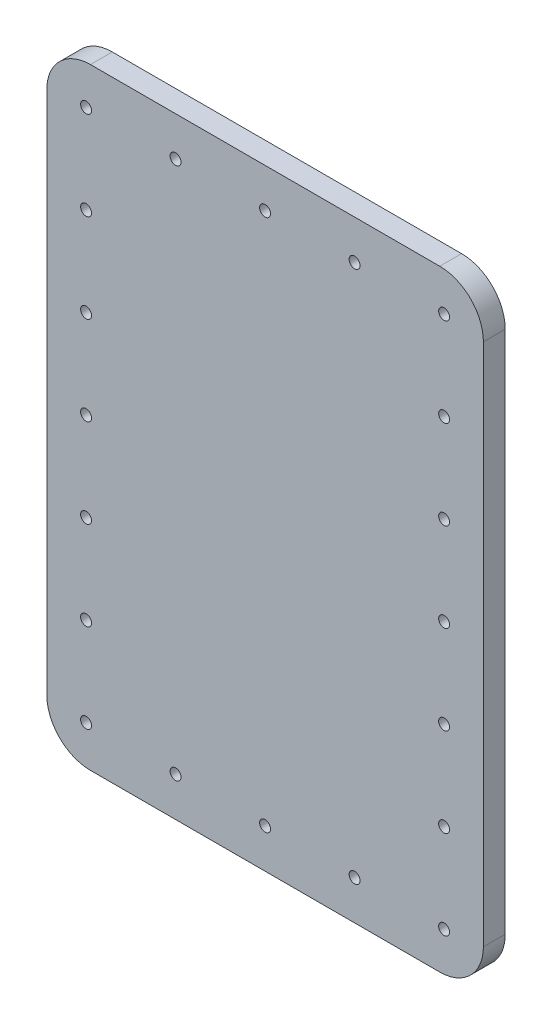
ISO-10303-21;
HEADER;
FILE_DESCRIPTION(('STEP AP214'),'2;1');
FILE_NAME('part.step','',(''),(''),'','','');
FILE_SCHEMA(('AUTOMOTIVE_DESIGN { 1 0 10303 214 1 1 1 1 }'));
ENDSEC;
DATA;
#1=APPLICATION_CONTEXT('core data for automotive mechanical design processes');
#2=APPLICATION_PROTOCOL_DEFINITION('international standard','automotive_design',2000,#1);
#3=PRODUCT_CONTEXT('',#1,'mechanical');
#4=PRODUCT('Part','Part','',(#3));
#5=PRODUCT_RELATED_PRODUCT_CATEGORY('part','',(#4));
#6=PRODUCT_DEFINITION_FORMATION('','',#4);
#7=PRODUCT_DEFINITION_CONTEXT('part definition',#1,'design');
#8=PRODUCT_DEFINITION('design','',#6,#7);
#9=PRODUCT_DEFINITION_SHAPE('','',#8);
#10=(LENGTH_UNIT() NAMED_UNIT(*) SI_UNIT(.MILLI.,.METRE.));
#11=(NAMED_UNIT(*) PLANE_ANGLE_UNIT() SI_UNIT($,.RADIAN.));
#12=(NAMED_UNIT(*) SI_UNIT($,.STERADIAN.) SOLID_ANGLE_UNIT());
#13=UNCERTAINTY_MEASURE_WITH_UNIT(LENGTH_MEASURE(1.E-05),#10,'distance_accuracy_value','');
#14=(GEOMETRIC_REPRESENTATION_CONTEXT(3) GLOBAL_UNCERTAINTY_ASSIGNED_CONTEXT((#13)) GLOBAL_UNIT_ASSIGNED_CONTEXT((#10,
#11,#12)) REPRESENTATION_CONTEXT('',''));
#15=CARTESIAN_POINT('',(0.,0.,0.));
#16=DIRECTION('',(0.,0.,1.));
#17=DIRECTION('',(1.,0.,0.));
#18=AXIS2_PLACEMENT_3D('',#15,#16,#17);
#19=CARTESIAN_POINT('',(0.,0.,5.));
#20=DIRECTION('',(0.,0.,-1.));
#21=DIRECTION('',(-1.,0.,0.));
#22=AXIS2_PLACEMENT_3D('',#19,#20,#21);
#23=PLANE('',#22);
#24=DIRECTION('',(0.,-1.,0.));
#25=VECTOR('',#24,1.);
#26=CARTESIAN_POINT('',(-50.,-70.,5.));
#27=LINE('',#26,#25);
#28=CARTESIAN_POINT('',(-50.,60.,5.));
#29=VERTEX_POINT('',#28);
#30=CARTESIAN_POINT('',(-50.,-60.,5.));
#31=VERTEX_POINT('',#30);
#32=EDGE_CURVE('E164',#29,#31,#27,.T.);
#33=ORIENTED_EDGE('',*,*,#32,.T.);
#34=CARTESIAN_POINT('',(-40.,-60.,5.));
#35=DIRECTION('',(0.,0.,-1.));
#36=DIRECTION('',(-1.,0.,0.));
#37=AXIS2_PLACEMENT_3D('',#34,#35,#36);
#38=CIRCLE('',#37,10.);
#39=CARTESIAN_POINT('',(-40.,-70.,5.));
#40=VERTEX_POINT('',#39);
#41=EDGE_CURVE('E147',#31,#40,#38,.F.);
#42=ORIENTED_EDGE('',*,*,#41,.T.);
#43=DIRECTION('',(1.,0.,0.));
#44=VECTOR('',#43,1.);
#45=CARTESIAN_POINT('',(-50.,-70.,5.));
#46=LINE('',#45,#44);
#47=CARTESIAN_POINT('',(40.,-70.,5.));
#48=VERTEX_POINT('',#47);
#49=EDGE_CURVE('E118',#40,#48,#46,.T.);
#50=ORIENTED_EDGE('',*,*,#49,.T.);
#51=CARTESIAN_POINT('',(40.,-60.,5.));
#52=DIRECTION('',(0.,0.,-1.));
#53=DIRECTION('',(-1.,0.,0.));
#54=AXIS2_PLACEMENT_3D('',#51,#52,#53);
#55=CIRCLE('',#54,10.);
#56=CARTESIAN_POINT('',(50.,-60.,5.));
#57=VERTEX_POINT('',#56);
#58=EDGE_CURVE('E145',#48,#57,#55,.F.);
#59=ORIENTED_EDGE('',*,*,#58,.T.);
#60=DIRECTION('',(0.,1.,0.));
#61=VECTOR('',#60,1.);
#62=CARTESIAN_POINT('',(50.,-70.,5.));
#63=LINE('',#62,#61);
#64=CARTESIAN_POINT('',(50.,60.,5.));
#65=VERTEX_POINT('',#64);
#66=EDGE_CURVE('E125',#57,#65,#63,.T.);
#67=ORIENTED_EDGE('',*,*,#66,.T.);
#68=CARTESIAN_POINT('',(40.,60.,5.));
#69=DIRECTION('',(0.,0.,-1.));
#70=DIRECTION('',(-1.,0.,0.));
#71=AXIS2_PLACEMENT_3D('',#68,#69,#70);
#72=CIRCLE('',#71,10.);
#73=CARTESIAN_POINT('',(40.,70.,5.));
#74=VERTEX_POINT('',#73);
#75=EDGE_CURVE('E53',#65,#74,#72,.F.);
#76=ORIENTED_EDGE('',*,*,#75,.T.);
#77=DIRECTION('',(-1.,0.,0.));
#78=VECTOR('',#77,1.);
#79=CARTESIAN_POINT('',(-50.,70.,5.));
#80=LINE('',#79,#78);
#81=CARTESIAN_POINT('',(-40.,70.,5.));
#82=VERTEX_POINT('',#81);
#83=EDGE_CURVE('E128',#74,#82,#80,.T.);
#84=ORIENTED_EDGE('',*,*,#83,.T.);
#85=CARTESIAN_POINT('',(-40.,60.,5.));
#86=DIRECTION('',(0.,0.,-1.));
#87=DIRECTION('',(-1.,0.,0.));
#88=AXIS2_PLACEMENT_3D('',#85,#86,#87);
#89=CIRCLE('',#88,10.);
#90=EDGE_CURVE('E143',#82,#29,#89,.F.);
#91=ORIENTED_EDGE('',*,*,#90,.T.);
#92=EDGE_LOOP('',(#33,#42,#50,#59,#67,#76,#84,#91));
#93=FACE_BOUND('',#92,.T.);
#94=CARTESIAN_POINT('',(0.,61.,5.));
#95=DIRECTION('',(0.,0.,1.));
#96=DIRECTION('',(1.,0.,0.));
#97=AXIS2_PLACEMENT_3D('',#94,#95,#96);
#98=CIRCLE('',#97,1.25);
#99=CARTESIAN_POINT('',(1.24999999999999,61.,5.));
#100=VERTEX_POINT('',#99);
#101=EDGE_CURVE('E160',#100,#100,#98,.T.);
#102=ORIENTED_EDGE('',*,*,#101,.F.);
#103=EDGE_LOOP('',(#102));
#104=FACE_BOUND('',#103,.T.);
#105=CARTESIAN_POINT('',(-41.,61.,5.));
#106=DIRECTION('',(0.,0.,1.));
#107=DIRECTION('',(1.,0.,0.));
#108=AXIS2_PLACEMENT_3D('',#105,#106,#107);
#109=CIRCLE('',#108,1.25);
#110=CARTESIAN_POINT('',(-39.75,61.,5.));
#111=VERTEX_POINT('',#110);
#112=EDGE_CURVE('E171',#111,#111,#109,.T.);
#113=ORIENTED_EDGE('',*,*,#112,.F.);
#114=EDGE_LOOP('',(#113));
#115=FACE_BOUND('',#114,.T.);
#116=CARTESIAN_POINT('',(-20.5,61.,5.));
#117=DIRECTION('',(0.,0.,1.));
#118=DIRECTION('',(1.,0.,0.));
#119=AXIS2_PLACEMENT_3D('',#116,#117,#118);
#120=CIRCLE('',#119,1.25);
#121=CARTESIAN_POINT('',(-19.25,61.,5.));
#122=VERTEX_POINT('',#121);
#123=EDGE_CURVE('E177',#122,#122,#120,.T.);
#124=ORIENTED_EDGE('',*,*,#123,.F.);
#125=EDGE_LOOP('',(#124));
#126=FACE_BOUND('',#125,.T.);
#127=CARTESIAN_POINT('',(20.5,61.,5.));
#128=DIRECTION('',(0.,0.,1.));
#129=DIRECTION('',(1.,0.,0.));
#130=AXIS2_PLACEMENT_3D('',#127,#128,#129);
#131=CIRCLE('',#130,1.25);
#132=CARTESIAN_POINT('',(21.75,61.,5.));
#133=VERTEX_POINT('',#132);
#134=EDGE_CURVE('E183',#133,#133,#131,.T.);
#135=ORIENTED_EDGE('',*,*,#134,.F.);
#136=EDGE_LOOP('',(#135));
#137=FACE_BOUND('',#136,.T.);
#138=CARTESIAN_POINT('',(41.,61.,5.));
#139=DIRECTION('',(0.,0.,1.));
#140=DIRECTION('',(1.,0.,0.));
#141=AXIS2_PLACEMENT_3D('',#138,#139,#140);
#142=CIRCLE('',#141,1.25);
#143=CARTESIAN_POINT('',(42.25,61.,5.));
#144=VERTEX_POINT('',#143);
#145=EDGE_CURVE('E189',#144,#144,#142,.T.);
#146=ORIENTED_EDGE('',*,*,#145,.F.);
#147=EDGE_LOOP('',(#146));
#148=FACE_BOUND('',#147,.T.);
#149=CARTESIAN_POINT('',(-41.,0.,5.));
#150=DIRECTION('',(0.,0.,1.));
#151=DIRECTION('',(1.,0.,0.));
#152=AXIS2_PLACEMENT_3D('',#149,#150,#151);
#153=CIRCLE('',#152,1.25);
#154=CARTESIAN_POINT('',(-39.75,0.,5.));
#155=VERTEX_POINT('',#154);
#156=EDGE_CURVE('E195',#155,#155,#153,.T.);
#157=ORIENTED_EDGE('',*,*,#156,.F.);
#158=EDGE_LOOP('',(#157));
#159=FACE_BOUND('',#158,.T.);
#160=CARTESIAN_POINT('',(-41.,40.6666666666667,5.));
#161=DIRECTION('',(0.,0.,1.));
#162=DIRECTION('',(1.,0.,0.));
#163=AXIS2_PLACEMENT_3D('',#160,#161,#162);
#164=CIRCLE('',#163,1.25);
#165=CARTESIAN_POINT('',(-39.75,40.6666666666667,5.));
#166=VERTEX_POINT('',#165);
#167=EDGE_CURVE('E201',#166,#166,#164,.T.);
#168=ORIENTED_EDGE('',*,*,#167,.F.);
#169=EDGE_LOOP('',(#168));
#170=FACE_BOUND('',#169,.T.);
#171=CARTESIAN_POINT('',(-41.,20.3333333333333,5.));
#172=DIRECTION('',(0.,0.,1.));
#173=DIRECTION('',(1.,0.,0.));
#174=AXIS2_PLACEMENT_3D('',#171,#172,#173);
#175=CIRCLE('',#174,1.25);
#176=CARTESIAN_POINT('',(-39.75,20.3333333333333,5.));
#177=VERTEX_POINT('',#176);
#178=EDGE_CURVE('E207',#177,#177,#175,.T.);
#179=ORIENTED_EDGE('',*,*,#178,.F.);
#180=EDGE_LOOP('',(#179));
#181=FACE_BOUND('',#180,.T.);
#182=CARTESIAN_POINT('',(41.,40.6666666666667,5.));
#183=DIRECTION('',(0.,0.,1.));
#184=DIRECTION('',(-1.,0.,0.));
#185=AXIS2_PLACEMENT_3D('',#182,#183,#184);
#186=CIRCLE('',#185,1.25);
#187=CARTESIAN_POINT('',(39.75,40.6666666666667,5.));
#188=VERTEX_POINT('',#187);
#189=EDGE_CURVE('E213',#188,#188,#186,.T.);
#190=ORIENTED_EDGE('',*,*,#189,.F.);
#191=EDGE_LOOP('',(#190));
#192=FACE_BOUND('',#191,.T.);
#193=CARTESIAN_POINT('',(41.,20.3333333333333,5.));
#194=DIRECTION('',(0.,0.,1.));
#195=DIRECTION('',(-1.,0.,0.));
#196=AXIS2_PLACEMENT_3D('',#193,#194,#195);
#197=CIRCLE('',#196,1.25);
#198=CARTESIAN_POINT('',(39.75,20.3333333333333,5.));
#199=VERTEX_POINT('',#198);
#200=EDGE_CURVE('E219',#199,#199,#197,.T.);
#201=ORIENTED_EDGE('',*,*,#200,.F.);
#202=EDGE_LOOP('',(#201));
#203=FACE_BOUND('',#202,.T.);
#204=CARTESIAN_POINT('',(41.,0.,5.));
#205=DIRECTION('',(0.,0.,1.));
#206=DIRECTION('',(-1.,0.,0.));
#207=AXIS2_PLACEMENT_3D('',#204,#205,#206);
#208=CIRCLE('',#207,1.25);
#209=CARTESIAN_POINT('',(39.75,0.,5.));
#210=VERTEX_POINT('',#209);
#211=EDGE_CURVE('E225',#210,#210,#208,.T.);
#212=ORIENTED_EDGE('',*,*,#211,.F.);
#213=EDGE_LOOP('',(#212));
#214=FACE_BOUND('',#213,.T.);
#215=CARTESIAN_POINT('',(-20.5,-61.,5.));
#216=DIRECTION('',(0.,0.,1.));
#217=DIRECTION('',(-1.,0.,0.));
#218=AXIS2_PLACEMENT_3D('',#215,#216,#217);
#219=CIRCLE('',#218,1.25);
#220=CARTESIAN_POINT('',(-21.75,-61.,5.));
#221=VERTEX_POINT('',#220);
#222=EDGE_CURVE('E231',#221,#221,#219,.T.);
#223=ORIENTED_EDGE('',*,*,#222,.F.);
#224=EDGE_LOOP('',(#223));
#225=FACE_BOUND('',#224,.T.);
#226=CARTESIAN_POINT('',(0.,-61.,5.));
#227=DIRECTION('',(0.,0.,1.));
#228=DIRECTION('',(-1.,0.,0.));
#229=AXIS2_PLACEMENT_3D('',#226,#227,#228);
#230=CIRCLE('',#229,1.25);
#231=CARTESIAN_POINT('',(-1.24999999999999,-61.,5.));
#232=VERTEX_POINT('',#231);
#233=EDGE_CURVE('E237',#232,#232,#230,.T.);
#234=ORIENTED_EDGE('',*,*,#233,.F.);
#235=EDGE_LOOP('',(#234));
#236=FACE_BOUND('',#235,.T.);
#237=CARTESIAN_POINT('',(20.5,-61.,5.));
#238=DIRECTION('',(0.,0.,1.));
#239=DIRECTION('',(-1.,0.,0.));
#240=AXIS2_PLACEMENT_3D('',#237,#238,#239);
#241=CIRCLE('',#240,1.25);
#242=CARTESIAN_POINT('',(19.25,-61.,5.));
#243=VERTEX_POINT('',#242);
#244=EDGE_CURVE('E243',#243,#243,#241,.T.);
#245=ORIENTED_EDGE('',*,*,#244,.F.);
#246=EDGE_LOOP('',(#245));
#247=FACE_BOUND('',#246,.T.);
#248=CARTESIAN_POINT('',(41.,-61.,5.));
#249=DIRECTION('',(0.,0.,1.));
#250=DIRECTION('',(-1.,0.,0.));
#251=AXIS2_PLACEMENT_3D('',#248,#249,#250);
#252=CIRCLE('',#251,1.25000000000001);
#253=CARTESIAN_POINT('',(39.75,-61.,5.));
#254=VERTEX_POINT('',#253);
#255=EDGE_CURVE('E249',#254,#254,#252,.T.);
#256=ORIENTED_EDGE('',*,*,#255,.F.);
#257=EDGE_LOOP('',(#256));
#258=FACE_BOUND('',#257,.T.);
#259=CARTESIAN_POINT('',(41.,-40.6666666666666,5.));
#260=DIRECTION('',(0.,0.,1.));
#261=DIRECTION('',(1.,0.,0.));
#262=AXIS2_PLACEMENT_3D('',#259,#260,#261);
#263=CIRCLE('',#262,1.25);
#264=CARTESIAN_POINT('',(42.25,-40.6666666666666,5.));
#265=VERTEX_POINT('',#264);
#266=EDGE_CURVE('E255',#265,#265,#263,.T.);
#267=ORIENTED_EDGE('',*,*,#266,.F.);
#268=EDGE_LOOP('',(#267));
#269=FACE_BOUND('',#268,.T.);
#270=CARTESIAN_POINT('',(41.,-20.3333333333333,5.));
#271=DIRECTION('',(0.,0.,1.));
#272=DIRECTION('',(1.,0.,0.));
#273=AXIS2_PLACEMENT_3D('',#270,#271,#272);
#274=CIRCLE('',#273,1.24999999999998);
#275=CARTESIAN_POINT('',(42.25,-20.3333333333333,5.));
#276=VERTEX_POINT('',#275);
#277=EDGE_CURVE('E261',#276,#276,#274,.T.);
#278=ORIENTED_EDGE('',*,*,#277,.F.);
#279=EDGE_LOOP('',(#278));
#280=FACE_BOUND('',#279,.T.);
#281=CARTESIAN_POINT('',(-41.,-20.3333333333333,5.));
#282=DIRECTION('',(0.,0.,1.));
#283=DIRECTION('',(-1.,0.,0.));
#284=AXIS2_PLACEMENT_3D('',#281,#282,#283);
#285=CIRCLE('',#284,1.25000000000001);
#286=CARTESIAN_POINT('',(-42.25,-20.3333333333333,5.));
#287=VERTEX_POINT('',#286);
#288=EDGE_CURVE('E267',#287,#287,#285,.T.);
#289=ORIENTED_EDGE('',*,*,#288,.F.);
#290=EDGE_LOOP('',(#289));
#291=FACE_BOUND('',#290,.T.);
#292=CARTESIAN_POINT('',(-41.,-40.6666666666667,5.));
#293=DIRECTION('',(0.,0.,1.));
#294=DIRECTION('',(-1.,0.,0.));
#295=AXIS2_PLACEMENT_3D('',#292,#293,#294);
#296=CIRCLE('',#295,1.25);
#297=CARTESIAN_POINT('',(-42.25,-40.6666666666667,5.));
#298=VERTEX_POINT('',#297);
#299=EDGE_CURVE('E273',#298,#298,#296,.T.);
#300=ORIENTED_EDGE('',*,*,#299,.F.);
#301=EDGE_LOOP('',(#300));
#302=FACE_BOUND('',#301,.T.);
#303=CARTESIAN_POINT('',(-41.,-61.,5.));
#304=DIRECTION('',(0.,0.,1.));
#305=DIRECTION('',(-1.,0.,0.));
#306=AXIS2_PLACEMENT_3D('',#303,#304,#305);
#307=CIRCLE('',#306,1.25000000000002);
#308=CARTESIAN_POINT('',(-42.25,-61.,5.));
#309=VERTEX_POINT('',#308);
#310=EDGE_CURVE('E279',#309,#309,#307,.T.);
#311=ORIENTED_EDGE('',*,*,#310,.F.);
#312=EDGE_LOOP('',(#311));
#313=FACE_BOUND('',#312,.T.);
#314=ADVANCED_FACE('F33',(#93,#104,#115,#126,#137,#148,#159,#170,#181,#192,#203,#214,#225,#236,
#247,#258,#269,#280,#291,#302,#313),#23,.F.);
#315=CARTESIAN_POINT('',(0.,0.,0.));
#316=DIRECTION('',(0.,0.,-1.));
#317=DIRECTION('',(-1.,0.,0.));
#318=AXIS2_PLACEMENT_3D('',#315,#316,#317);
#319=PLANE('',#318);
#320=CARTESIAN_POINT('',(-41.,-40.6666666666667,0.));
#321=DIRECTION('',(0.,0.,1.));
#322=DIRECTION('',(-1.,0.,0.));
#323=AXIS2_PLACEMENT_3D('',#320,#321,#322);
#324=CIRCLE('',#323,1.25);
#325=CARTESIAN_POINT('',(-42.25,-40.6666666666667,0.));
#326=VERTEX_POINT('',#325);
#327=EDGE_CURVE('E276',#326,#326,#324,.T.);
#328=ORIENTED_EDGE('',*,*,#327,.T.);
#329=EDGE_LOOP('',(#328));
#330=FACE_BOUND('',#329,.T.);
#331=CARTESIAN_POINT('',(41.,-20.3333333333333,0.));
#332=DIRECTION('',(0.,0.,1.));
#333=DIRECTION('',(1.,0.,0.));
#334=AXIS2_PLACEMENT_3D('',#331,#332,#333);
#335=CIRCLE('',#334,1.24999999999998);
#336=CARTESIAN_POINT('',(42.25,-20.3333333333333,0.));
#337=VERTEX_POINT('',#336);
#338=EDGE_CURVE('E264',#337,#337,#335,.T.);
#339=ORIENTED_EDGE('',*,*,#338,.T.);
#340=EDGE_LOOP('',(#339));
#341=FACE_BOUND('',#340,.T.);
#342=CARTESIAN_POINT('',(41.,-61.,0.));
#343=DIRECTION('',(0.,0.,1.));
#344=DIRECTION('',(-1.,0.,0.));
#345=AXIS2_PLACEMENT_3D('',#342,#343,#344);
#346=CIRCLE('',#345,1.25000000000001);
#347=CARTESIAN_POINT('',(39.75,-61.,0.));
#348=VERTEX_POINT('',#347);
#349=EDGE_CURVE('E252',#348,#348,#346,.T.);
#350=ORIENTED_EDGE('',*,*,#349,.T.);
#351=EDGE_LOOP('',(#350));
#352=FACE_BOUND('',#351,.T.);
#353=CARTESIAN_POINT('',(0.,-61.,0.));
#354=DIRECTION('',(0.,0.,1.));
#355=DIRECTION('',(-1.,0.,0.));
#356=AXIS2_PLACEMENT_3D('',#353,#354,#355);
#357=CIRCLE('',#356,1.25);
#358=CARTESIAN_POINT('',(-1.24999999999999,-61.,0.));
#359=VERTEX_POINT('',#358);
#360=EDGE_CURVE('E240',#359,#359,#357,.T.);
#361=ORIENTED_EDGE('',*,*,#360,.T.);
#362=EDGE_LOOP('',(#361));
#363=FACE_BOUND('',#362,.T.);
#364=CARTESIAN_POINT('',(41.,0.,0.));
#365=DIRECTION('',(0.,0.,1.));
#366=DIRECTION('',(-1.,0.,0.));
#367=AXIS2_PLACEMENT_3D('',#364,#365,#366);
#368=CIRCLE('',#367,1.25);
#369=CARTESIAN_POINT('',(39.75,0.,0.));
#370=VERTEX_POINT('',#369);
#371=EDGE_CURVE('E228',#370,#370,#368,.T.);
#372=ORIENTED_EDGE('',*,*,#371,.T.);
#373=EDGE_LOOP('',(#372));
#374=FACE_BOUND('',#373,.T.);
#375=CARTESIAN_POINT('',(41.,40.6666666666667,0.));
#376=DIRECTION('',(0.,0.,1.));
#377=DIRECTION('',(-1.,0.,0.));
#378=AXIS2_PLACEMENT_3D('',#375,#376,#377);
#379=CIRCLE('',#378,1.25);
#380=CARTESIAN_POINT('',(39.75,40.6666666666667,0.));
#381=VERTEX_POINT('',#380);
#382=EDGE_CURVE('E216',#381,#381,#379,.T.);
#383=ORIENTED_EDGE('',*,*,#382,.T.);
#384=EDGE_LOOP('',(#383));
#385=FACE_BOUND('',#384,.T.);
#386=CARTESIAN_POINT('',(-41.,40.6666666666667,0.));
#387=DIRECTION('',(0.,0.,1.));
#388=DIRECTION('',(1.,0.,0.));
#389=AXIS2_PLACEMENT_3D('',#386,#387,#388);
#390=CIRCLE('',#389,1.25);
#391=CARTESIAN_POINT('',(-39.75,40.6666666666667,0.));
#392=VERTEX_POINT('',#391);
#393=EDGE_CURVE('E204',#392,#392,#390,.T.);
#394=ORIENTED_EDGE('',*,*,#393,.T.);
#395=EDGE_LOOP('',(#394));
#396=FACE_BOUND('',#395,.T.);
#397=CARTESIAN_POINT('',(41.,61.,0.));
#398=DIRECTION('',(0.,0.,1.));
#399=DIRECTION('',(1.,0.,0.));
#400=AXIS2_PLACEMENT_3D('',#397,#398,#399);
#401=CIRCLE('',#400,1.25);
#402=CARTESIAN_POINT('',(42.25,61.,0.));
#403=VERTEX_POINT('',#402);
#404=EDGE_CURVE('E192',#403,#403,#401,.T.);
#405=ORIENTED_EDGE('',*,*,#404,.T.);
#406=EDGE_LOOP('',(#405));
#407=FACE_BOUND('',#406,.T.);
#408=CARTESIAN_POINT('',(-20.5,61.,0.));
#409=DIRECTION('',(0.,0.,1.));
#410=DIRECTION('',(1.,0.,0.));
#411=AXIS2_PLACEMENT_3D('',#408,#409,#410);
#412=CIRCLE('',#411,1.25);
#413=CARTESIAN_POINT('',(-19.25,61.,0.));
#414=VERTEX_POINT('',#413);
#415=EDGE_CURVE('E180',#414,#414,#412,.T.);
#416=ORIENTED_EDGE('',*,*,#415,.T.);
#417=EDGE_LOOP('',(#416));
#418=FACE_BOUND('',#417,.T.);
#419=CARTESIAN_POINT('',(0.,61.,0.));
#420=DIRECTION('',(0.,0.,1.));
#421=DIRECTION('',(1.,0.,0.));
#422=AXIS2_PLACEMENT_3D('',#419,#420,#421);
#423=CIRCLE('',#422,1.25);
#424=CARTESIAN_POINT('',(1.24999999999999,61.,0.));
#425=VERTEX_POINT('',#424);
#426=EDGE_CURVE('E168',#425,#425,#423,.T.);
#427=ORIENTED_EDGE('',*,*,#426,.T.);
#428=EDGE_LOOP('',(#427));
#429=FACE_BOUND('',#428,.T.);
#430=DIRECTION('',(1.,0.,0.));
#431=VECTOR('',#430,1.);
#432=CARTESIAN_POINT('',(-50.,-70.,0.));
#433=LINE('',#432,#431);
#434=CARTESIAN_POINT('',(-40.,-70.,0.));
#435=VERTEX_POINT('',#434);
#436=CARTESIAN_POINT('',(40.,-70.,0.));
#437=VERTEX_POINT('',#436);
#438=EDGE_CURVE('E115',#435,#437,#433,.T.);
#439=ORIENTED_EDGE('',*,*,#438,.F.);
#440=CARTESIAN_POINT('',(-40.,-60.,0.));
#441=DIRECTION('',(0.,0.,-1.));
#442=DIRECTION('',(-1.,0.,0.));
#443=AXIS2_PLACEMENT_3D('',#440,#441,#442);
#444=CIRCLE('',#443,10.);
#445=CARTESIAN_POINT('',(-50.,-60.,0.));
#446=VERTEX_POINT('',#445);
#447=EDGE_CURVE('E98',#435,#446,#444,.T.);
#448=ORIENTED_EDGE('',*,*,#447,.T.);
#449=DIRECTION('',(0.,-1.,0.));
#450=VECTOR('',#449,1.);
#451=CARTESIAN_POINT('',(-50.,-70.,0.));
#452=LINE('',#451,#450);
#453=CARTESIAN_POINT('',(-50.,60.,0.));
#454=VERTEX_POINT('',#453);
#455=EDGE_CURVE('E126',#454,#446,#452,.T.);
#456=ORIENTED_EDGE('',*,*,#455,.F.);
#457=CARTESIAN_POINT('',(-40.,60.,0.));
#458=DIRECTION('',(0.,0.,-1.));
#459=DIRECTION('',(-1.,0.,0.));
#460=AXIS2_PLACEMENT_3D('',#457,#458,#459);
#461=CIRCLE('',#460,10.);
#462=CARTESIAN_POINT('',(-40.,70.,0.));
#463=VERTEX_POINT('',#462);
#464=EDGE_CURVE('E136',#454,#463,#461,.T.);
#465=ORIENTED_EDGE('',*,*,#464,.T.);
#466=DIRECTION('',(-1.,0.,0.));
#467=VECTOR('',#466,1.);
#468=CARTESIAN_POINT('',(-50.,70.,0.));
#469=LINE('',#468,#467);
#470=CARTESIAN_POINT('',(40.,70.,0.));
#471=VERTEX_POINT('',#470);
#472=EDGE_CURVE('E130',#471,#463,#469,.T.);
#473=ORIENTED_EDGE('',*,*,#472,.F.);
#474=CARTESIAN_POINT('',(40.,60.,0.));
#475=DIRECTION('',(0.,0.,-1.));
#476=DIRECTION('',(-1.,0.,0.));
#477=AXIS2_PLACEMENT_3D('',#474,#475,#476);
#478=CIRCLE('',#477,10.);
#479=CARTESIAN_POINT('',(50.,60.,0.));
#480=VERTEX_POINT('',#479);
#481=EDGE_CURVE('E119',#471,#480,#478,.T.);
#482=ORIENTED_EDGE('',*,*,#481,.T.);
#483=DIRECTION('',(0.,1.,0.));
#484=VECTOR('',#483,1.);
#485=CARTESIAN_POINT('',(50.,-70.,0.));
#486=LINE('',#485,#484);
#487=CARTESIAN_POINT('',(50.,-60.,0.));
#488=VERTEX_POINT('',#487);
#489=EDGE_CURVE('E159',#488,#480,#486,.T.);
#490=ORIENTED_EDGE('',*,*,#489,.F.);
#491=CARTESIAN_POINT('',(40.,-60.,0.));
#492=DIRECTION('',(0.,0.,-1.));
#493=DIRECTION('',(-1.,0.,0.));
#494=AXIS2_PLACEMENT_3D('',#491,#492,#493);
#495=CIRCLE('',#494,10.);
#496=EDGE_CURVE('E109',#488,#437,#495,.T.);
#497=ORIENTED_EDGE('',*,*,#496,.T.);
#498=EDGE_LOOP('',(#439,#448,#456,#465,#473,#482,#490,#497));
#499=FACE_BOUND('',#498,.T.);
#500=CARTESIAN_POINT('',(-41.,61.,0.));
#501=DIRECTION('',(0.,0.,1.));
#502=DIRECTION('',(1.,0.,0.));
#503=AXIS2_PLACEMENT_3D('',#500,#501,#502);
#504=CIRCLE('',#503,1.25);
#505=CARTESIAN_POINT('',(-39.75,61.,0.));
#506=VERTEX_POINT('',#505);
#507=EDGE_CURVE('E174',#506,#506,#504,.T.);
#508=ORIENTED_EDGE('',*,*,#507,.T.);
#509=EDGE_LOOP('',(#508));
#510=FACE_BOUND('',#509,.T.);
#511=CARTESIAN_POINT('',(20.5,61.,0.));
#512=DIRECTION('',(0.,0.,1.));
#513=DIRECTION('',(1.,0.,0.));
#514=AXIS2_PLACEMENT_3D('',#511,#512,#513);
#515=CIRCLE('',#514,1.25);
#516=CARTESIAN_POINT('',(21.75,61.,0.));
#517=VERTEX_POINT('',#516);
#518=EDGE_CURVE('E186',#517,#517,#515,.T.);
#519=ORIENTED_EDGE('',*,*,#518,.T.);
#520=EDGE_LOOP('',(#519));
#521=FACE_BOUND('',#520,.T.);
#522=CARTESIAN_POINT('',(-41.,0.,0.));
#523=DIRECTION('',(0.,0.,1.));
#524=DIRECTION('',(1.,0.,0.));
#525=AXIS2_PLACEMENT_3D('',#522,#523,#524);
#526=CIRCLE('',#525,1.25);
#527=CARTESIAN_POINT('',(-39.75,0.,0.));
#528=VERTEX_POINT('',#527);
#529=EDGE_CURVE('E198',#528,#528,#526,.T.);
#530=ORIENTED_EDGE('',*,*,#529,.T.);
#531=EDGE_LOOP('',(#530));
#532=FACE_BOUND('',#531,.T.);
#533=CARTESIAN_POINT('',(-41.,20.3333333333333,0.));
#534=DIRECTION('',(0.,0.,1.));
#535=DIRECTION('',(1.,0.,0.));
#536=AXIS2_PLACEMENT_3D('',#533,#534,#535);
#537=CIRCLE('',#536,1.25);
#538=CARTESIAN_POINT('',(-39.75,20.3333333333333,0.));
#539=VERTEX_POINT('',#538);
#540=EDGE_CURVE('E210',#539,#539,#537,.T.);
#541=ORIENTED_EDGE('',*,*,#540,.T.);
#542=EDGE_LOOP('',(#541));
#543=FACE_BOUND('',#542,.T.);
#544=CARTESIAN_POINT('',(41.,20.3333333333333,0.));
#545=DIRECTION('',(0.,0.,1.));
#546=DIRECTION('',(-1.,0.,0.));
#547=AXIS2_PLACEMENT_3D('',#544,#545,#546);
#548=CIRCLE('',#547,1.25);
#549=CARTESIAN_POINT('',(39.75,20.3333333333333,0.));
#550=VERTEX_POINT('',#549);
#551=EDGE_CURVE('E222',#550,#550,#548,.T.);
#552=ORIENTED_EDGE('',*,*,#551,.T.);
#553=EDGE_LOOP('',(#552));
#554=FACE_BOUND('',#553,.T.);
#555=CARTESIAN_POINT('',(-20.5,-61.,0.));
#556=DIRECTION('',(0.,0.,1.));
#557=DIRECTION('',(-1.,0.,0.));
#558=AXIS2_PLACEMENT_3D('',#555,#556,#557);
#559=CIRCLE('',#558,1.25);
#560=CARTESIAN_POINT('',(-21.75,-61.,0.));
#561=VERTEX_POINT('',#560);
#562=EDGE_CURVE('E234',#561,#561,#559,.T.);
#563=ORIENTED_EDGE('',*,*,#562,.T.);
#564=EDGE_LOOP('',(#563));
#565=FACE_BOUND('',#564,.T.);
#566=CARTESIAN_POINT('',(20.5,-61.,0.));
#567=DIRECTION('',(0.,0.,1.));
#568=DIRECTION('',(-1.,0.,0.));
#569=AXIS2_PLACEMENT_3D('',#566,#567,#568);
#570=CIRCLE('',#569,1.25);
#571=CARTESIAN_POINT('',(19.25,-61.,0.));
#572=VERTEX_POINT('',#571);
#573=EDGE_CURVE('E246',#572,#572,#570,.T.);
#574=ORIENTED_EDGE('',*,*,#573,.T.);
#575=EDGE_LOOP('',(#574));
#576=FACE_BOUND('',#575,.T.);
#577=CARTESIAN_POINT('',(41.,-40.6666666666666,0.));
#578=DIRECTION('',(0.,0.,1.));
#579=DIRECTION('',(1.,0.,0.));
#580=AXIS2_PLACEMENT_3D('',#577,#578,#579);
#581=CIRCLE('',#580,1.25);
#582=CARTESIAN_POINT('',(42.25,-40.6666666666666,0.));
#583=VERTEX_POINT('',#582);
#584=EDGE_CURVE('E258',#583,#583,#581,.T.);
#585=ORIENTED_EDGE('',*,*,#584,.T.);
#586=EDGE_LOOP('',(#585));
#587=FACE_BOUND('',#586,.T.);
#588=CARTESIAN_POINT('',(-41.,-20.3333333333333,0.));
#589=DIRECTION('',(0.,0.,1.));
#590=DIRECTION('',(-1.,0.,0.));
#591=AXIS2_PLACEMENT_3D('',#588,#589,#590);
#592=CIRCLE('',#591,1.25000000000001);
#593=CARTESIAN_POINT('',(-42.25,-20.3333333333333,0.));
#594=VERTEX_POINT('',#593);
#595=EDGE_CURVE('E270',#594,#594,#592,.T.);
#596=ORIENTED_EDGE('',*,*,#595,.T.);
#597=EDGE_LOOP('',(#596));
#598=FACE_BOUND('',#597,.T.);
#599=CARTESIAN_POINT('',(-41.,-61.,0.));
#600=DIRECTION('',(0.,0.,1.));
#601=DIRECTION('',(-1.,0.,0.));
#602=AXIS2_PLACEMENT_3D('',#599,#600,#601);
#603=CIRCLE('',#602,1.25000000000002);
#604=CARTESIAN_POINT('',(-42.25,-61.,0.));
#605=VERTEX_POINT('',#604);
#606=EDGE_CURVE('E282',#605,#605,#603,.T.);
#607=ORIENTED_EDGE('',*,*,#606,.T.);
#608=EDGE_LOOP('',(#607));
#609=FACE_BOUND('',#608,.T.);
#610=ADVANCED_FACE('F122',(#330,#341,#352,#363,#374,#385,#396,#407,#418,#429,#499,#510,#521,
#532,#543,#554,#565,#576,#587,#598,#609),#319,.T.);
#611=CARTESIAN_POINT('',(50.,-70.,5.));
#612=DIRECTION('',(-1.,0.,0.));
#613=DIRECTION('',(0.,0.,1.));
#614=AXIS2_PLACEMENT_3D('',#611,#612,#613);
#615=PLANE('',#614);
#616=ORIENTED_EDGE('',*,*,#66,.F.);
#617=DIRECTION('',(0.,0.,-1.));
#618=VECTOR('',#617,1.);
#619=CARTESIAN_POINT('',(50.,-60.,5.));
#620=LINE('',#619,#618);
#621=EDGE_CURVE('E151',#57,#488,#620,.T.);
#622=ORIENTED_EDGE('',*,*,#621,.T.);
#623=ORIENTED_EDGE('',*,*,#489,.T.);
#624=DIRECTION('',(0.,0.,-1.));
#625=VECTOR('',#624,1.);
#626=CARTESIAN_POINT('',(50.,60.,5.));
#627=LINE('',#626,#625);
#628=EDGE_CURVE('E149',#480,#65,#627,.F.);
#629=ORIENTED_EDGE('',*,*,#628,.T.);
#630=EDGE_LOOP('',(#616,#622,#623,#629));
#631=FACE_BOUND('',#630,.T.);
#632=ADVANCED_FACE('F297',(#631),#615,.F.);
#633=CARTESIAN_POINT('',(-50.,70.,5.));
#634=DIRECTION('',(0.,-1.,0.));
#635=DIRECTION('',(0.,0.,-1.));
#636=AXIS2_PLACEMENT_3D('',#633,#634,#635);
#637=PLANE('',#636);
#638=ORIENTED_EDGE('',*,*,#472,.T.);
#639=DIRECTION('',(0.,0.,-1.));
#640=VECTOR('',#639,1.);
#641=CARTESIAN_POINT('',(-40.,70.,5.));
#642=LINE('',#641,#640);
#643=EDGE_CURVE('E11',#463,#82,#642,.F.);
#644=ORIENTED_EDGE('',*,*,#643,.T.);
#645=ORIENTED_EDGE('',*,*,#83,.F.);
#646=DIRECTION('',(0.,0.,-1.));
#647=VECTOR('',#646,1.);
#648=CARTESIAN_POINT('',(40.,70.,5.));
#649=LINE('',#648,#647);
#650=EDGE_CURVE('E41',#74,#471,#649,.T.);
#651=ORIENTED_EDGE('',*,*,#650,.T.);
#652=EDGE_LOOP('',(#638,#644,#645,#651));
#653=FACE_BOUND('',#652,.T.);
#654=ADVANCED_FACE('F156',(#653),#637,.F.);
#655=CARTESIAN_POINT('',(-50.,-70.,5.));
#656=DIRECTION('',(1.,0.,0.));
#657=DIRECTION('',(0.,0.,-1.));
#658=AXIS2_PLACEMENT_3D('',#655,#656,#657);
#659=PLANE('',#658);
#660=ORIENTED_EDGE('',*,*,#455,.T.);
#661=DIRECTION('',(0.,0.,-1.));
#662=VECTOR('',#661,1.);
#663=CARTESIAN_POINT('',(-50.,-60.,5.));
#664=LINE('',#663,#662);
#665=EDGE_CURVE('E103',#446,#31,#664,.F.);
#666=ORIENTED_EDGE('',*,*,#665,.T.);
#667=ORIENTED_EDGE('',*,*,#32,.F.);
#668=DIRECTION('',(0.,0.,-1.));
#669=VECTOR('',#668,1.);
#670=CARTESIAN_POINT('',(-50.,60.,5.));
#671=LINE('',#670,#669);
#672=EDGE_CURVE('E108',#29,#454,#671,.T.);
#673=ORIENTED_EDGE('',*,*,#672,.T.);
#674=EDGE_LOOP('',(#660,#666,#667,#673));
#675=FACE_BOUND('',#674,.T.);
#676=ADVANCED_FACE('F307',(#675),#659,.F.);
#677=CARTESIAN_POINT('',(-50.,-70.,5.));
#678=DIRECTION('',(0.,1.,0.));
#679=DIRECTION('',(0.,0.,1.));
#680=AXIS2_PLACEMENT_3D('',#677,#678,#679);
#681=PLANE('',#680);
#682=ORIENTED_EDGE('',*,*,#49,.F.);
#683=DIRECTION('',(0.,0.,-1.));
#684=VECTOR('',#683,1.);
#685=CARTESIAN_POINT('',(-40.,-70.,5.));
#686=LINE('',#685,#684);
#687=EDGE_CURVE('E102',#40,#435,#686,.T.);
#688=ORIENTED_EDGE('',*,*,#687,.T.);
#689=ORIENTED_EDGE('',*,*,#438,.T.);
#690=DIRECTION('',(0.,0.,-1.));
#691=VECTOR('',#690,1.);
#692=CARTESIAN_POINT('',(40.,-70.,5.));
#693=LINE('',#692,#691);
#694=EDGE_CURVE('E120',#437,#48,#693,.F.);
#695=ORIENTED_EDGE('',*,*,#694,.T.);
#696=EDGE_LOOP('',(#682,#688,#689,#695));
#697=FACE_BOUND('',#696,.T.);
#698=ADVANCED_FACE('F114',(#697),#681,.F.);
#699=CARTESIAN_POINT('',(0.,61.,5.));
#700=DIRECTION('',(0.,0.,-1.));
#701=DIRECTION('',(-1.,0.,0.));
#702=AXIS2_PLACEMENT_3D('',#699,#700,#701);
#703=CYLINDRICAL_SURFACE('',#702,1.25);
#704=ORIENTED_EDGE('',*,*,#101,.T.);
#705=EDGE_LOOP('',(#704));
#706=FACE_BOUND('',#705,.T.);
#707=ORIENTED_EDGE('',*,*,#426,.F.);
#708=EDGE_LOOP('',(#707));
#709=FACE_BOUND('',#708,.T.);
#710=ADVANCED_FACE('F302',(#706,#709),#703,.F.);
#711=CARTESIAN_POINT('',(-41.,61.,5.));
#712=DIRECTION('',(0.,0.,-1.));
#713=DIRECTION('',(-1.,0.,0.));
#714=AXIS2_PLACEMENT_3D('',#711,#712,#713);
#715=CYLINDRICAL_SURFACE('',#714,1.25);
#716=ORIENTED_EDGE('',*,*,#112,.T.);
#717=EDGE_LOOP('',(#716));
#718=FACE_BOUND('',#717,.T.);
#719=ORIENTED_EDGE('',*,*,#507,.F.);
#720=EDGE_LOOP('',(#719));
#721=FACE_BOUND('',#720,.T.);
#722=ADVANCED_FACE('F398',(#718,#721),#715,.F.);
#723=CARTESIAN_POINT('',(-20.5,61.,5.));
#724=DIRECTION('',(0.,0.,-1.));
#725=DIRECTION('',(-1.,0.,0.));
#726=AXIS2_PLACEMENT_3D('',#723,#724,#725);
#727=CYLINDRICAL_SURFACE('',#726,1.25);
#728=ORIENTED_EDGE('',*,*,#123,.T.);
#729=EDGE_LOOP('',(#728));
#730=FACE_BOUND('',#729,.T.);
#731=ORIENTED_EDGE('',*,*,#415,.F.);
#732=EDGE_LOOP('',(#731));
#733=FACE_BOUND('',#732,.T.);
#734=ADVANCED_FACE('F406',(#730,#733),#727,.F.);
#735=CARTESIAN_POINT('',(20.5,61.,5.));
#736=DIRECTION('',(0.,0.,-1.));
#737=DIRECTION('',(-1.,0.,0.));
#738=AXIS2_PLACEMENT_3D('',#735,#736,#737);
#739=CYLINDRICAL_SURFACE('',#738,1.25);
#740=ORIENTED_EDGE('',*,*,#134,.T.);
#741=EDGE_LOOP('',(#740));
#742=FACE_BOUND('',#741,.T.);
#743=ORIENTED_EDGE('',*,*,#518,.F.);
#744=EDGE_LOOP('',(#743));
#745=FACE_BOUND('',#744,.T.);
#746=ADVANCED_FACE('F414',(#742,#745),#739,.F.);
#747=CARTESIAN_POINT('',(41.,61.,5.));
#748=DIRECTION('',(0.,0.,-1.));
#749=DIRECTION('',(-1.,0.,0.));
#750=AXIS2_PLACEMENT_3D('',#747,#748,#749);
#751=CYLINDRICAL_SURFACE('',#750,1.25);
#752=ORIENTED_EDGE('',*,*,#145,.T.);
#753=EDGE_LOOP('',(#752));
#754=FACE_BOUND('',#753,.T.);
#755=ORIENTED_EDGE('',*,*,#404,.F.);
#756=EDGE_LOOP('',(#755));
#757=FACE_BOUND('',#756,.T.);
#758=ADVANCED_FACE('F423',(#754,#757),#751,.F.);
#759=CARTESIAN_POINT('',(-41.,0.,5.));
#760=DIRECTION('',(0.,0.,-1.));
#761=DIRECTION('',(-1.,0.,0.));
#762=AXIS2_PLACEMENT_3D('',#759,#760,#761);
#763=CYLINDRICAL_SURFACE('',#762,1.25);
#764=ORIENTED_EDGE('',*,*,#156,.T.);
#765=EDGE_LOOP('',(#764));
#766=FACE_BOUND('',#765,.T.);
#767=ORIENTED_EDGE('',*,*,#529,.F.);
#768=EDGE_LOOP('',(#767));
#769=FACE_BOUND('',#768,.T.);
#770=ADVANCED_FACE('F432',(#766,#769),#763,.F.);
#771=CARTESIAN_POINT('',(-41.,40.6666666666667,5.));
#772=DIRECTION('',(0.,0.,-1.));
#773=DIRECTION('',(-1.,0.,0.));
#774=AXIS2_PLACEMENT_3D('',#771,#772,#773);
#775=CYLINDRICAL_SURFACE('',#774,1.25);
#776=ORIENTED_EDGE('',*,*,#167,.T.);
#777=EDGE_LOOP('',(#776));
#778=FACE_BOUND('',#777,.T.);
#779=ORIENTED_EDGE('',*,*,#393,.F.);
#780=EDGE_LOOP('',(#779));
#781=FACE_BOUND('',#780,.T.);
#782=ADVANCED_FACE('F441',(#778,#781),#775,.F.);
#783=CARTESIAN_POINT('',(-41.,20.3333333333333,5.));
#784=DIRECTION('',(0.,0.,-1.));
#785=DIRECTION('',(-1.,0.,0.));
#786=AXIS2_PLACEMENT_3D('',#783,#784,#785);
#787=CYLINDRICAL_SURFACE('',#786,1.25);
#788=ORIENTED_EDGE('',*,*,#178,.T.);
#789=EDGE_LOOP('',(#788));
#790=FACE_BOUND('',#789,.T.);
#791=ORIENTED_EDGE('',*,*,#540,.F.);
#792=EDGE_LOOP('',(#791));
#793=FACE_BOUND('',#792,.T.);
#794=ADVANCED_FACE('F450',(#790,#793),#787,.F.);
#795=CARTESIAN_POINT('',(41.,40.6666666666667,5.));
#796=DIRECTION('',(0.,0.,-1.));
#797=DIRECTION('',(-1.,0.,0.));
#798=AXIS2_PLACEMENT_3D('',#795,#796,#797);
#799=CYLINDRICAL_SURFACE('',#798,1.25);
#800=ORIENTED_EDGE('',*,*,#189,.T.);
#801=EDGE_LOOP('',(#800));
#802=FACE_BOUND('',#801,.T.);
#803=ORIENTED_EDGE('',*,*,#382,.F.);
#804=EDGE_LOOP('',(#803));
#805=FACE_BOUND('',#804,.T.);
#806=ADVANCED_FACE('F459',(#802,#805),#799,.F.);
#807=CARTESIAN_POINT('',(41.,20.3333333333333,5.));
#808=DIRECTION('',(0.,0.,-1.));
#809=DIRECTION('',(-1.,0.,0.));
#810=AXIS2_PLACEMENT_3D('',#807,#808,#809);
#811=CYLINDRICAL_SURFACE('',#810,1.25);
#812=ORIENTED_EDGE('',*,*,#200,.T.);
#813=EDGE_LOOP('',(#812));
#814=FACE_BOUND('',#813,.T.);
#815=ORIENTED_EDGE('',*,*,#551,.F.);
#816=EDGE_LOOP('',(#815));
#817=FACE_BOUND('',#816,.T.);
#818=ADVANCED_FACE('F468',(#814,#817),#811,.F.);
#819=CARTESIAN_POINT('',(41.,0.,5.));
#820=DIRECTION('',(0.,0.,-1.));
#821=DIRECTION('',(-1.,0.,0.));
#822=AXIS2_PLACEMENT_3D('',#819,#820,#821);
#823=CYLINDRICAL_SURFACE('',#822,1.25);
#824=ORIENTED_EDGE('',*,*,#211,.T.);
#825=EDGE_LOOP('',(#824));
#826=FACE_BOUND('',#825,.T.);
#827=ORIENTED_EDGE('',*,*,#371,.F.);
#828=EDGE_LOOP('',(#827));
#829=FACE_BOUND('',#828,.T.);
#830=ADVANCED_FACE('F477',(#826,#829),#823,.F.);
#831=CARTESIAN_POINT('',(-20.5,-61.,5.));
#832=DIRECTION('',(0.,0.,-1.));
#833=DIRECTION('',(-1.,0.,0.));
#834=AXIS2_PLACEMENT_3D('',#831,#832,#833);
#835=CYLINDRICAL_SURFACE('',#834,1.25);
#836=ORIENTED_EDGE('',*,*,#222,.T.);
#837=EDGE_LOOP('',(#836));
#838=FACE_BOUND('',#837,.T.);
#839=ORIENTED_EDGE('',*,*,#562,.F.);
#840=EDGE_LOOP('',(#839));
#841=FACE_BOUND('',#840,.T.);
#842=ADVANCED_FACE('F486',(#838,#841),#835,.F.);
#843=CARTESIAN_POINT('',(0.,-61.,5.));
#844=DIRECTION('',(0.,0.,-1.));
#845=DIRECTION('',(-1.,0.,0.));
#846=AXIS2_PLACEMENT_3D('',#843,#844,#845);
#847=CYLINDRICAL_SURFACE('',#846,1.25);
#848=ORIENTED_EDGE('',*,*,#233,.T.);
#849=EDGE_LOOP('',(#848));
#850=FACE_BOUND('',#849,.T.);
#851=ORIENTED_EDGE('',*,*,#360,.F.);
#852=EDGE_LOOP('',(#851));
#853=FACE_BOUND('',#852,.T.);
#854=ADVANCED_FACE('F495',(#850,#853),#847,.F.);
#855=CARTESIAN_POINT('',(20.5,-61.,5.));
#856=DIRECTION('',(0.,0.,-1.));
#857=DIRECTION('',(-1.,0.,0.));
#858=AXIS2_PLACEMENT_3D('',#855,#856,#857);
#859=CYLINDRICAL_SURFACE('',#858,1.25);
#860=ORIENTED_EDGE('',*,*,#244,.T.);
#861=EDGE_LOOP('',(#860));
#862=FACE_BOUND('',#861,.T.);
#863=ORIENTED_EDGE('',*,*,#573,.F.);
#864=EDGE_LOOP('',(#863));
#865=FACE_BOUND('',#864,.T.);
#866=ADVANCED_FACE('F504',(#862,#865),#859,.F.);
#867=CARTESIAN_POINT('',(41.,-61.,5.));
#868=DIRECTION('',(0.,0.,-1.));
#869=DIRECTION('',(-1.,0.,0.));
#870=AXIS2_PLACEMENT_3D('',#867,#868,#869);
#871=CYLINDRICAL_SURFACE('',#870,1.25000000000001);
#872=ORIENTED_EDGE('',*,*,#255,.T.);
#873=EDGE_LOOP('',(#872));
#874=FACE_BOUND('',#873,.T.);
#875=ORIENTED_EDGE('',*,*,#349,.F.);
#876=EDGE_LOOP('',(#875));
#877=FACE_BOUND('',#876,.T.);
#878=ADVANCED_FACE('F513',(#874,#877),#871,.F.);
#879=CARTESIAN_POINT('',(41.,-40.6666666666666,5.));
#880=DIRECTION('',(0.,0.,-1.));
#881=DIRECTION('',(-1.,0.,0.));
#882=AXIS2_PLACEMENT_3D('',#879,#880,#881);
#883=CYLINDRICAL_SURFACE('',#882,1.25);
#884=ORIENTED_EDGE('',*,*,#266,.T.);
#885=EDGE_LOOP('',(#884));
#886=FACE_BOUND('',#885,.T.);
#887=ORIENTED_EDGE('',*,*,#584,.F.);
#888=EDGE_LOOP('',(#887));
#889=FACE_BOUND('',#888,.T.);
#890=ADVANCED_FACE('F522',(#886,#889),#883,.F.);
#891=CARTESIAN_POINT('',(41.,-20.3333333333333,5.));
#892=DIRECTION('',(0.,0.,-1.));
#893=DIRECTION('',(-1.,0.,0.));
#894=AXIS2_PLACEMENT_3D('',#891,#892,#893);
#895=CYLINDRICAL_SURFACE('',#894,1.24999999999998);
#896=ORIENTED_EDGE('',*,*,#277,.T.);
#897=EDGE_LOOP('',(#896));
#898=FACE_BOUND('',#897,.T.);
#899=ORIENTED_EDGE('',*,*,#338,.F.);
#900=EDGE_LOOP('',(#899));
#901=FACE_BOUND('',#900,.T.);
#902=ADVANCED_FACE('F531',(#898,#901),#895,.F.);
#903=CARTESIAN_POINT('',(-41.,-20.3333333333333,5.));
#904=DIRECTION('',(0.,0.,-1.));
#905=DIRECTION('',(-1.,0.,0.));
#906=AXIS2_PLACEMENT_3D('',#903,#904,#905);
#907=CYLINDRICAL_SURFACE('',#906,1.25000000000001);
#908=ORIENTED_EDGE('',*,*,#288,.T.);
#909=EDGE_LOOP('',(#908));
#910=FACE_BOUND('',#909,.T.);
#911=ORIENTED_EDGE('',*,*,#595,.F.);
#912=EDGE_LOOP('',(#911));
#913=FACE_BOUND('',#912,.T.);
#914=ADVANCED_FACE('F540',(#910,#913),#907,.F.);
#915=CARTESIAN_POINT('',(-41.,-40.6666666666667,5.));
#916=DIRECTION('',(0.,0.,-1.));
#917=DIRECTION('',(-1.,0.,0.));
#918=AXIS2_PLACEMENT_3D('',#915,#916,#917);
#919=CYLINDRICAL_SURFACE('',#918,1.25);
#920=ORIENTED_EDGE('',*,*,#299,.T.);
#921=EDGE_LOOP('',(#920));
#922=FACE_BOUND('',#921,.T.);
#923=ORIENTED_EDGE('',*,*,#327,.F.);
#924=EDGE_LOOP('',(#923));
#925=FACE_BOUND('',#924,.T.);
#926=ADVANCED_FACE('F549',(#922,#925),#919,.F.);
#927=CARTESIAN_POINT('',(-41.,-61.,5.));
#928=DIRECTION('',(0.,0.,-1.));
#929=DIRECTION('',(-1.,0.,0.));
#930=AXIS2_PLACEMENT_3D('',#927,#928,#929);
#931=CYLINDRICAL_SURFACE('',#930,1.25000000000002);
#932=ORIENTED_EDGE('',*,*,#310,.T.);
#933=EDGE_LOOP('',(#932));
#934=FACE_BOUND('',#933,.T.);
#935=ORIENTED_EDGE('',*,*,#606,.F.);
#936=EDGE_LOOP('',(#935));
#937=FACE_BOUND('',#936,.T.);
#938=ADVANCED_FACE('F288',(#934,#937),#931,.F.);
#939=CARTESIAN_POINT('',(-40.,-60.,5.));
#940=DIRECTION('',(0.,0.,-1.));
#941=DIRECTION('',(-1.,0.,0.));
#942=AXIS2_PLACEMENT_3D('',#939,#940,#941);
#943=CYLINDRICAL_SURFACE('',#942,10.);
#944=ORIENTED_EDGE('',*,*,#41,.F.);
#945=ORIENTED_EDGE('',*,*,#665,.F.);
#946=ORIENTED_EDGE('',*,*,#447,.F.);
#947=ORIENTED_EDGE('',*,*,#687,.F.);
#948=EDGE_LOOP('',(#944,#945,#946,#947));
#949=FACE_BOUND('',#948,.T.);
#950=ADVANCED_FACE('F101',(#949),#943,.T.);
#951=CARTESIAN_POINT('',(40.,-60.,5.));
#952=DIRECTION('',(0.,0.,-1.));
#953=DIRECTION('',(-1.,0.,0.));
#954=AXIS2_PLACEMENT_3D('',#951,#952,#953);
#955=CYLINDRICAL_SURFACE('',#954,10.);
#956=ORIENTED_EDGE('',*,*,#58,.F.);
#957=ORIENTED_EDGE('',*,*,#694,.F.);
#958=ORIENTED_EDGE('',*,*,#496,.F.);
#959=ORIENTED_EDGE('',*,*,#621,.F.);
#960=EDGE_LOOP('',(#956,#957,#958,#959));
#961=FACE_BOUND('',#960,.T.);
#962=ADVANCED_FACE('F318',(#961),#955,.T.);
#963=CARTESIAN_POINT('',(-40.,60.,5.));
#964=DIRECTION('',(0.,0.,-1.));
#965=DIRECTION('',(-1.,0.,0.));
#966=AXIS2_PLACEMENT_3D('',#963,#964,#965);
#967=CYLINDRICAL_SURFACE('',#966,10.);
#968=ORIENTED_EDGE('',*,*,#90,.F.);
#969=ORIENTED_EDGE('',*,*,#643,.F.);
#970=ORIENTED_EDGE('',*,*,#464,.F.);
#971=ORIENTED_EDGE('',*,*,#672,.F.);
#972=EDGE_LOOP('',(#968,#969,#970,#971));
#973=FACE_BOUND('',#972,.T.);
#974=ADVANCED_FACE('F320',(#973),#967,.T.);
#975=CARTESIAN_POINT('',(40.,60.,5.));
#976=DIRECTION('',(0.,0.,-1.));
#977=DIRECTION('',(-1.,0.,0.));
#978=AXIS2_PLACEMENT_3D('',#975,#976,#977);
#979=CYLINDRICAL_SURFACE('',#978,10.);
#980=ORIENTED_EDGE('',*,*,#75,.F.);
#981=ORIENTED_EDGE('',*,*,#628,.F.);
#982=ORIENTED_EDGE('',*,*,#481,.F.);
#983=ORIENTED_EDGE('',*,*,#650,.F.);
#984=EDGE_LOOP('',(#980,#981,#982,#983));
#985=FACE_BOUND('',#984,.T.);
#986=ADVANCED_FACE('F35',(#985),#979,.T.);
#987=CLOSED_SHELL('',(#314,#610,#632,#654,#676,#698,#710,#722,#734,#746,#758,#770,#782,#794,
#806,#818,#830,#842,#854,#866,#878,#890,#902,#914,#926,#938,#950,#962,#974,#986));
#988=MANIFOLD_SOLID_BREP('B2',#987);
#989=ADVANCED_BREP_SHAPE_REPRESENTATION('',(#18,#988),#14);
#990=SHAPE_DEFINITION_REPRESENTATION(#9,#989);
ENDSEC;
END-ISO-10303-21;
